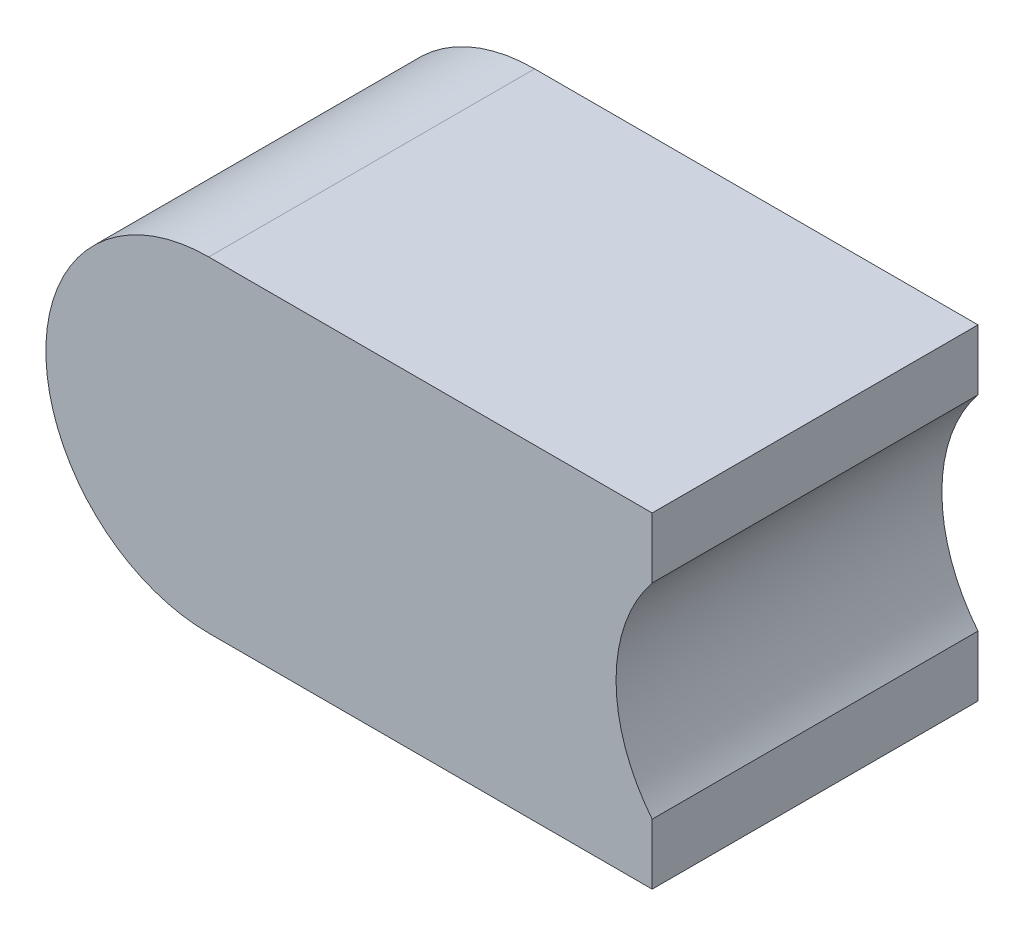
ISO-10303-21;
HEADER;
FILE_DESCRIPTION(('STEP AP214'),'2;1');
FILE_NAME('part.step','',(''),(''),'','','');
FILE_SCHEMA(('AUTOMOTIVE_DESIGN { 1 0 10303 214 1 1 1 1 }'));
ENDSEC;
DATA;
#1=APPLICATION_CONTEXT('core data for automotive mechanical design processes');
#2=APPLICATION_PROTOCOL_DEFINITION('international standard','automotive_design',2000,#1);
#3=PRODUCT_CONTEXT('',#1,'mechanical');
#4=PRODUCT('Part','Part','',(#3));
#5=PRODUCT_RELATED_PRODUCT_CATEGORY('part','',(#4));
#6=PRODUCT_DEFINITION_FORMATION('','',#4);
#7=PRODUCT_DEFINITION_CONTEXT('part definition',#1,'design');
#8=PRODUCT_DEFINITION('design','',#6,#7);
#9=PRODUCT_DEFINITION_SHAPE('','',#8);
#10=(LENGTH_UNIT() NAMED_UNIT(*) SI_UNIT(.MILLI.,.METRE.));
#11=(NAMED_UNIT(*) PLANE_ANGLE_UNIT() SI_UNIT($,.RADIAN.));
#12=(NAMED_UNIT(*) SI_UNIT($,.STERADIAN.) SOLID_ANGLE_UNIT());
#13=UNCERTAINTY_MEASURE_WITH_UNIT(LENGTH_MEASURE(1.E-05),#10,'distance_accuracy_value','');
#14=(GEOMETRIC_REPRESENTATION_CONTEXT(3) GLOBAL_UNCERTAINTY_ASSIGNED_CONTEXT((#13)) GLOBAL_UNIT_ASSIGNED_CONTEXT((#10,
#11,#12)) REPRESENTATION_CONTEXT('',''));
#15=CARTESIAN_POINT('',(0.,0.,0.));
#16=DIRECTION('',(0.,0.,1.));
#17=DIRECTION('',(1.,0.,0.));
#18=AXIS2_PLACEMENT_3D('',#15,#16,#17);
#19=CARTESIAN_POINT('',(0.,25.4,50.8));
#20=DIRECTION('',(0.,0.,-1.));
#21=DIRECTION('',(-1.,0.,0.));
#22=AXIS2_PLACEMENT_3D('',#19,#20,#21);
#23=CYLINDRICAL_SURFACE('',#22,25.4);
#24=CARTESIAN_POINT('',(0.,25.4,0.));
#25=DIRECTION('',(0.,0.,1.));
#26=DIRECTION('',(1.,0.,0.));
#27=AXIS2_PLACEMENT_3D('',#24,#25,#26);
#28=CIRCLE('',#27,25.4);
#29=CARTESIAN_POINT('',(0.,50.8,0.));
#30=VERTEX_POINT('',#29);
#31=CARTESIAN_POINT('',(0.,0.,0.));
#32=VERTEX_POINT('',#31);
#33=EDGE_CURVE('E128',#30,#32,#28,.T.);
#34=ORIENTED_EDGE('',*,*,#33,.T.);
#35=DIRECTION('',(0.,0.,-1.));
#36=VECTOR('',#35,1.);
#37=CARTESIAN_POINT('',(0.,0.,50.8));
#38=LINE('',#37,#36);
#39=CARTESIAN_POINT('',(0.,0.,50.8));
#40=VERTEX_POINT('',#39);
#41=EDGE_CURVE('E11',#40,#32,#38,.T.);
#42=ORIENTED_EDGE('',*,*,#41,.F.);
#43=CARTESIAN_POINT('',(0.,25.4,50.8));
#44=DIRECTION('',(0.,0.,1.));
#45=DIRECTION('',(1.,0.,0.));
#46=AXIS2_PLACEMENT_3D('',#43,#44,#45);
#47=CIRCLE('',#46,25.4);
#48=CARTESIAN_POINT('',(0.,50.8,50.8));
#49=VERTEX_POINT('',#48);
#50=EDGE_CURVE('E144',#49,#40,#47,.T.);
#51=ORIENTED_EDGE('',*,*,#50,.F.);
#52=DIRECTION('',(0.,0.,-1.));
#53=VECTOR('',#52,1.);
#54=CARTESIAN_POINT('',(0.,50.8,50.8));
#55=LINE('',#54,#53);
#56=EDGE_CURVE('E124',#49,#30,#55,.T.);
#57=ORIENTED_EDGE('',*,*,#56,.T.);
#58=EDGE_LOOP('',(#34,#42,#51,#57));
#59=FACE_BOUND('',#58,.T.);
#60=ADVANCED_FACE('F39',(#59),#23,.T.);
#61=CARTESIAN_POINT('',(0.,0.,50.8));
#62=DIRECTION('',(0.,1.,0.));
#63=DIRECTION('',(-1.,0.,0.));
#64=AXIS2_PLACEMENT_3D('',#61,#62,#63);
#65=PLANE('',#64);
#66=DIRECTION('',(1.,0.,0.));
#67=VECTOR('',#66,1.);
#68=CARTESIAN_POINT('',(0.,0.,0.));
#69=LINE('',#68,#67);
#70=CARTESIAN_POINT('',(69.1300261354886,0.,0.));
#71=VERTEX_POINT('',#70);
#72=EDGE_CURVE('E132',#32,#71,#69,.T.);
#73=ORIENTED_EDGE('',*,*,#72,.T.);
#74=DIRECTION('',(0.,0.,-1.));
#75=VECTOR('',#74,1.);
#76=CARTESIAN_POINT('',(69.1300261354886,0.,50.8));
#77=LINE('',#76,#75);
#78=CARTESIAN_POINT('',(69.1300261354886,0.,50.8));
#79=VERTEX_POINT('',#78);
#80=EDGE_CURVE('E48',#79,#71,#77,.T.);
#81=ORIENTED_EDGE('',*,*,#80,.F.);
#82=DIRECTION('',(1.,0.,0.));
#83=VECTOR('',#82,1.);
#84=CARTESIAN_POINT('',(0.,0.,50.8));
#85=LINE('',#84,#83);
#86=EDGE_CURVE('E93',#40,#79,#85,.T.);
#87=ORIENTED_EDGE('',*,*,#86,.F.);
#88=ORIENTED_EDGE('',*,*,#41,.T.);
#89=EDGE_LOOP('',(#73,#81,#87,#88));
#90=FACE_BOUND('',#89,.T.);
#91=ADVANCED_FACE('F172',(#90),#65,.F.);
#92=CARTESIAN_POINT('',(69.1300261354886,0.,50.8));
#93=DIRECTION('',(-1.,0.,0.));
#94=DIRECTION('',(0.,-1.,0.));
#95=AXIS2_PLACEMENT_3D('',#92,#93,#94);
#96=PLANE('',#95);
#97=DIRECTION('',(0.,1.,0.));
#98=VECTOR('',#97,1.);
#99=CARTESIAN_POINT('',(69.1300261354886,0.,0.));
#100=LINE('',#99,#98);
#101=CARTESIAN_POINT('',(69.1300261354886,9.4529584751109,0.));
#102=VERTEX_POINT('',#101);
#103=EDGE_CURVE('E135',#71,#102,#100,.T.);
#104=ORIENTED_EDGE('',*,*,#103,.T.);
#105=DIRECTION('',(0.,0.,-1.));
#106=VECTOR('',#105,1.);
#107=CARTESIAN_POINT('',(69.1300261354886,9.4529584751109,50.8));
#108=LINE('',#107,#106);
#109=CARTESIAN_POINT('',(69.1300261354886,9.4529584751109,50.8));
#110=VERTEX_POINT('',#109);
#111=EDGE_CURVE('E117',#110,#102,#108,.T.);
#112=ORIENTED_EDGE('',*,*,#111,.F.);
#113=DIRECTION('',(0.,1.,0.));
#114=VECTOR('',#113,1.);
#115=CARTESIAN_POINT('',(69.1300261354886,0.,50.8));
#116=LINE('',#115,#114);
#117=EDGE_CURVE('E106',#79,#110,#116,.T.);
#118=ORIENTED_EDGE('',*,*,#117,.F.);
#119=ORIENTED_EDGE('',*,*,#80,.T.);
#120=EDGE_LOOP('',(#104,#112,#118,#119));
#121=FACE_BOUND('',#120,.T.);
#122=ADVANCED_FACE('F154',(#121),#96,.F.);
#123=CARTESIAN_POINT('',(88.9,25.4,50.8));
#124=DIRECTION('',(0.,0.,-1.));
#125=DIRECTION('',(-1.,0.,0.));
#126=AXIS2_PLACEMENT_3D('',#123,#124,#125);
#127=CYLINDRICAL_SURFACE('',#126,25.4);
#128=CARTESIAN_POINT('',(88.9,25.4,0.));
#129=DIRECTION('',(0.,0.,-1.));
#130=DIRECTION('',(-1.,0.,0.));
#131=AXIS2_PLACEMENT_3D('',#128,#129,#130);
#132=CIRCLE('',#131,25.4);
#133=CARTESIAN_POINT('',(69.1300261354886,41.3470415248891,0.));
#134=VERTEX_POINT('',#133);
#135=EDGE_CURVE('E115',#102,#134,#132,.T.);
#136=ORIENTED_EDGE('',*,*,#135,.T.);
#137=DIRECTION('',(0.,0.,-1.));
#138=VECTOR('',#137,1.);
#139=CARTESIAN_POINT('',(69.1300261354886,41.3470415248891,50.8));
#140=LINE('',#139,#138);
#141=CARTESIAN_POINT('',(69.1300261354886,41.3470415248891,50.8));
#142=VERTEX_POINT('',#141);
#143=EDGE_CURVE('E112',#142,#134,#140,.T.);
#144=ORIENTED_EDGE('',*,*,#143,.F.);
#145=CARTESIAN_POINT('',(88.9,25.4,50.8));
#146=DIRECTION('',(0.,0.,-1.));
#147=DIRECTION('',(-1.,0.,0.));
#148=AXIS2_PLACEMENT_3D('',#145,#146,#147);
#149=CIRCLE('',#148,25.4);
#150=EDGE_CURVE('E100',#110,#142,#149,.T.);
#151=ORIENTED_EDGE('',*,*,#150,.F.);
#152=ORIENTED_EDGE('',*,*,#111,.T.);
#153=EDGE_LOOP('',(#136,#144,#151,#152));
#154=FACE_BOUND('',#153,.T.);
#155=ADVANCED_FACE('F113',(#154),#127,.F.);
#156=CARTESIAN_POINT('',(69.1300261354886,41.3470415248891,50.8));
#157=DIRECTION('',(-1.,0.,0.));
#158=DIRECTION('',(0.,-1.,0.));
#159=AXIS2_PLACEMENT_3D('',#156,#157,#158);
#160=PLANE('',#159);
#161=DIRECTION('',(0.,1.,0.));
#162=VECTOR('',#161,1.);
#163=CARTESIAN_POINT('',(69.1300261354886,41.3470415248891,0.));
#164=LINE('',#163,#162);
#165=CARTESIAN_POINT('',(69.1300261354886,50.8,0.));
#166=VERTEX_POINT('',#165);
#167=EDGE_CURVE('E79',#134,#166,#164,.T.);
#168=ORIENTED_EDGE('',*,*,#167,.T.);
#169=DIRECTION('',(0.,0.,-1.));
#170=VECTOR('',#169,1.);
#171=CARTESIAN_POINT('',(69.1300261354886,50.8,50.8));
#172=LINE('',#171,#170);
#173=CARTESIAN_POINT('',(69.1300261354886,50.8,50.8));
#174=VERTEX_POINT('',#173);
#175=EDGE_CURVE('E118',#174,#166,#172,.T.);
#176=ORIENTED_EDGE('',*,*,#175,.F.);
#177=DIRECTION('',(0.,1.,0.));
#178=VECTOR('',#177,1.);
#179=CARTESIAN_POINT('',(69.1300261354886,41.3470415248891,50.8));
#180=LINE('',#179,#178);
#181=EDGE_CURVE('E104',#142,#174,#180,.T.);
#182=ORIENTED_EDGE('',*,*,#181,.F.);
#183=ORIENTED_EDGE('',*,*,#143,.T.);
#184=EDGE_LOOP('',(#168,#176,#182,#183));
#185=FACE_BOUND('',#184,.T.);
#186=ADVANCED_FACE('F120',(#185),#160,.F.);
#187=CARTESIAN_POINT('',(0.,50.8,50.8));
#188=DIRECTION('',(0.,-1.,0.));
#189=DIRECTION('',(0.,0.,-1.));
#190=AXIS2_PLACEMENT_3D('',#187,#188,#189);
#191=PLANE('',#190);
#192=DIRECTION('',(-1.,0.,0.));
#193=VECTOR('',#192,1.);
#194=CARTESIAN_POINT('',(0.,50.8,0.));
#195=LINE('',#194,#193);
#196=EDGE_CURVE('E85',#166,#30,#195,.T.);
#197=ORIENTED_EDGE('',*,*,#196,.T.);
#198=ORIENTED_EDGE('',*,*,#56,.F.);
#199=DIRECTION('',(-1.,0.,0.));
#200=VECTOR('',#199,1.);
#201=CARTESIAN_POINT('',(0.,50.8,50.8));
#202=LINE('',#201,#200);
#203=EDGE_CURVE('E56',#174,#49,#202,.T.);
#204=ORIENTED_EDGE('',*,*,#203,.F.);
#205=ORIENTED_EDGE('',*,*,#175,.T.);
#206=EDGE_LOOP('',(#197,#198,#204,#205));
#207=FACE_BOUND('',#206,.T.);
#208=ADVANCED_FACE('F161',(#207),#191,.F.);
#209=CARTESIAN_POINT('',(0.,25.4,50.8));
#210=DIRECTION('',(0.,0.,1.));
#211=DIRECTION('',(1.,0.,0.));
#212=AXIS2_PLACEMENT_3D('',#209,#210,#211);
#213=PLANE('',#212);
#214=ORIENTED_EDGE('',*,*,#50,.T.);
#215=ORIENTED_EDGE('',*,*,#86,.T.);
#216=ORIENTED_EDGE('',*,*,#117,.T.);
#217=ORIENTED_EDGE('',*,*,#150,.T.);
#218=ORIENTED_EDGE('',*,*,#181,.T.);
#219=ORIENTED_EDGE('',*,*,#203,.T.);
#220=EDGE_LOOP('',(#214,#215,#216,#217,#218,#219));
#221=FACE_BOUND('',#220,.T.);
#222=ADVANCED_FACE('F102',(#221),#213,.T.);
#223=CARTESIAN_POINT('',(0.,25.4,0.));
#224=DIRECTION('',(0.,0.,1.));
#225=DIRECTION('',(1.,0.,0.));
#226=AXIS2_PLACEMENT_3D('',#223,#224,#225);
#227=PLANE('',#226);
#228=ORIENTED_EDGE('',*,*,#33,.F.);
#229=ORIENTED_EDGE('',*,*,#196,.F.);
#230=ORIENTED_EDGE('',*,*,#167,.F.);
#231=ORIENTED_EDGE('',*,*,#135,.F.);
#232=ORIENTED_EDGE('',*,*,#103,.F.);
#233=ORIENTED_EDGE('',*,*,#72,.F.);
#234=EDGE_LOOP('',(#228,#229,#230,#231,#232,#233));
#235=FACE_BOUND('',#234,.T.);
#236=ADVANCED_FACE('F157',(#235),#227,.F.);
#237=CLOSED_SHELL('',(#60,#91,#122,#155,#186,#208,#222,#236));
#238=MANIFOLD_SOLID_BREP('B2',#237);
#239=ADVANCED_BREP_SHAPE_REPRESENTATION('',(#18,#238),#14);
#240=SHAPE_DEFINITION_REPRESENTATION(#9,#239);
ENDSEC;
END-ISO-10303-21;
